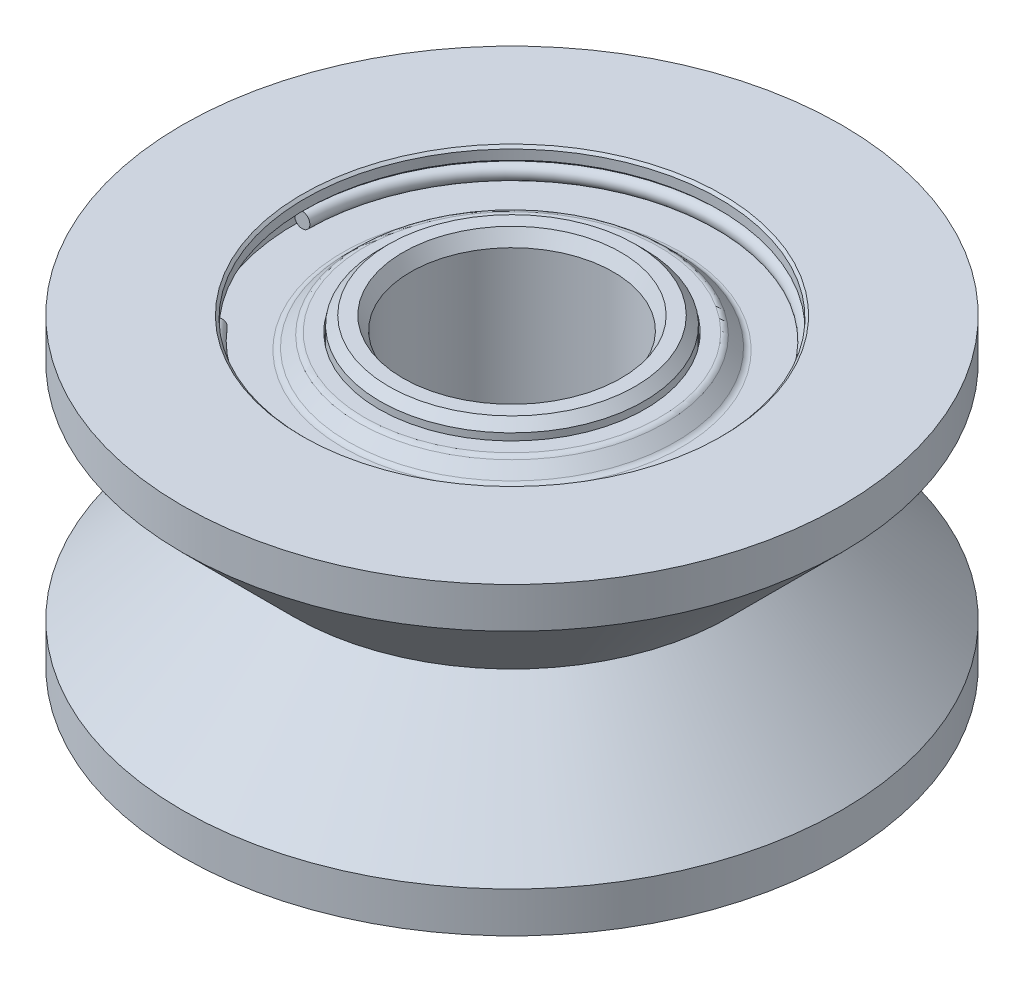
ISO-10303-21;
HEADER;
FILE_DESCRIPTION(('STEP AP214'),'2;1');
FILE_NAME('part.step','',(''),(''),'','','');
FILE_SCHEMA(('AUTOMOTIVE_DESIGN { 1 0 10303 214 1 1 1 1 }'));
ENDSEC;
DATA;
#1=APPLICATION_CONTEXT('core data for automotive mechanical design processes');
#2=APPLICATION_PROTOCOL_DEFINITION('international standard','automotive_design',2000,#1);
#3=PRODUCT_CONTEXT('',#1,'mechanical');
#4=PRODUCT('Part','Part','',(#3));
#5=PRODUCT_RELATED_PRODUCT_CATEGORY('part','',(#4));
#6=PRODUCT_DEFINITION_FORMATION('','',#4);
#7=PRODUCT_DEFINITION_CONTEXT('part definition',#1,'design');
#8=PRODUCT_DEFINITION('design','',#6,#7);
#9=PRODUCT_DEFINITION_SHAPE('','',#8);
#10=(LENGTH_UNIT() NAMED_UNIT(*) SI_UNIT(.MILLI.,.METRE.));
#11=(NAMED_UNIT(*) PLANE_ANGLE_UNIT() SI_UNIT($,.RADIAN.));
#12=(NAMED_UNIT(*) SI_UNIT($,.STERADIAN.) SOLID_ANGLE_UNIT());
#13=UNCERTAINTY_MEASURE_WITH_UNIT(LENGTH_MEASURE(1.E-05),#10,'distance_accuracy_value','');
#14=(GEOMETRIC_REPRESENTATION_CONTEXT(3) GLOBAL_UNCERTAINTY_ASSIGNED_CONTEXT((#13)) GLOBAL_UNIT_ASSIGNED_CONTEXT((#10,
#11,#12)) REPRESENTATION_CONTEXT('',''));
#15=CARTESIAN_POINT('',(0.,0.,0.));
#16=DIRECTION('',(0.,0.,1.));
#17=DIRECTION('',(1.,0.,0.));
#18=AXIS2_PLACEMENT_3D('',#15,#16,#17);
#19=CARTESIAN_POINT('',(0.,0.544,0.));
#20=DIRECTION('',(0.,-1.,0.));
#21=DIRECTION('',(0.,0.,-1.));
#22=AXIS2_PLACEMENT_3D('',#19,#20,#21);
#23=PLANE('',#22);
#24=CARTESIAN_POINT('',(0.,0.544,0.));
#25=DIRECTION('',(0.,-1.,0.));
#26=DIRECTION('',(0.,0.,1.));
#27=AXIS2_PLACEMENT_3D('',#24,#25,#26);
#28=CIRCLE('',#27,2.6);
#29=CARTESIAN_POINT('',(0.,0.544,2.6));
#30=VERTEX_POINT('',#29);
#31=EDGE_CURVE('P0_E32',#30,#30,#28,.T.);
#32=ORIENTED_EDGE('',*,*,#31,.F.);
#33=EDGE_LOOP('',(#32));
#34=FACE_BOUND('',#33,.T.);
#35=CARTESIAN_POINT('',(0.,0.544,0.));
#36=DIRECTION('',(0.,1.,0.));
#37=DIRECTION('',(0.,0.,1.));
#38=AXIS2_PLACEMENT_3D('',#35,#36,#37);
#39=CIRCLE('',#38,2.625);
#40=CARTESIAN_POINT('',(0.,0.544,2.625));
#41=VERTEX_POINT('',#40);
#42=EDGE_CURVE('P0_E97',#41,#41,#39,.T.);
#43=ORIENTED_EDGE('',*,*,#42,.F.);
#44=EDGE_LOOP('',(#43));
#45=FACE_BOUND('',#44,.T.);
#46=ADVANCED_FACE('P0_F15',(#34,#45),#23,.T.);
#47=CARTESIAN_POINT('',(0.,5.456,0.));
#48=DIRECTION('',(0.,1.,0.));
#49=DIRECTION('',(1.,0.,0.));
#50=AXIS2_PLACEMENT_3D('',#47,#48,#49);
#51=PLANE('',#50);
#52=CARTESIAN_POINT('',(0.,5.456,0.));
#53=DIRECTION('',(0.,-1.,0.));
#54=DIRECTION('',(0.,0.,1.));
#55=AXIS2_PLACEMENT_3D('',#52,#53,#54);
#56=CIRCLE('',#55,2.6);
#57=CARTESIAN_POINT('',(0.,5.456,2.6));
#58=VERTEX_POINT('',#57);
#59=EDGE_CURVE('P0_E23',#58,#58,#56,.T.);
#60=ORIENTED_EDGE('',*,*,#59,.T.);
#61=EDGE_LOOP('',(#60));
#62=FACE_BOUND('',#61,.T.);
#63=CARTESIAN_POINT('',(0.,5.456,0.));
#64=DIRECTION('',(0.,1.,0.));
#65=DIRECTION('',(0.,0.,1.));
#66=AXIS2_PLACEMENT_3D('',#63,#64,#65);
#67=CIRCLE('',#66,2.625);
#68=CARTESIAN_POINT('',(0.,5.456,2.625));
#69=VERTEX_POINT('',#68);
#70=EDGE_CURVE('P0_E94',#69,#69,#67,.T.);
#71=ORIENTED_EDGE('',*,*,#70,.T.);
#72=EDGE_LOOP('',(#71));
#73=FACE_BOUND('',#72,.T.);
#74=ADVANCED_FACE('P0_F17',(#62,#73),#51,.T.);
#75=CARTESIAN_POINT('',(0.,0.59,0.));
#76=DIRECTION('',(0.,-1.,0.));
#77=DIRECTION('',(0.,0.,-1.));
#78=AXIS2_PLACEMENT_3D('',#75,#76,#77);
#79=PLANE('',#78);
#80=CARTESIAN_POINT('',(0.,0.59,0.));
#81=DIRECTION('',(0.,1.,0.));
#82=DIRECTION('',(0.,0.,-1.));
#83=AXIS2_PLACEMENT_3D('',#80,#81,#82);
#84=CIRCLE('',#83,3.32453017998293);
#85=CARTESIAN_POINT('',(0.,0.59,-3.32453017998293));
#86=VERTEX_POINT('',#85);
#87=EDGE_CURVE('P0_E68',#86,#86,#84,.T.);
#88=ORIENTED_EDGE('',*,*,#87,.T.);
#89=EDGE_LOOP('',(#88));
#90=FACE_BOUND('',#89,.T.);
#91=CARTESIAN_POINT('',(0.,0.59,0.));
#92=DIRECTION('',(0.,1.,0.));
#93=DIRECTION('',(0.,0.,1.));
#94=AXIS2_PLACEMENT_3D('',#91,#92,#93);
#95=CIRCLE('',#94,4.285);
#96=CARTESIAN_POINT('',(0.,0.59,4.285));
#97=VERTEX_POINT('',#96);
#98=EDGE_CURVE('P0_E63',#97,#97,#95,.T.);
#99=ORIENTED_EDGE('',*,*,#98,.F.);
#100=EDGE_LOOP('',(#99));
#101=FACE_BOUND('',#100,.T.);
#102=ADVANCED_FACE('P0_F209',(#90,#101),#79,.T.);
#103=CARTESIAN_POINT('',(0.,0.29,0.));
#104=DIRECTION('',(0.,-1.,0.));
#105=DIRECTION('',(0.,0.,-1.));
#106=AXIS2_PLACEMENT_3D('',#103,#104,#105);
#107=PLANE('',#106);
#108=CARTESIAN_POINT('',(0.,0.29,0.));
#109=DIRECTION('',(0.,-1.,0.));
#110=DIRECTION('',(0.,0.,-1.));
#111=AXIS2_PLACEMENT_3D('',#108,#109,#110);
#112=CIRCLE('',#111,4.135);
#113=CARTESIAN_POINT('',(0.,0.29,-4.135));
#114=VERTEX_POINT('',#113);
#115=EDGE_CURVE('P0_E83',#114,#114,#112,.T.);
#116=ORIENTED_EDGE('',*,*,#115,.T.);
#117=EDGE_LOOP('',(#116));
#118=FACE_BOUND('',#117,.T.);
#119=CARTESIAN_POINT('',(0.,0.29,0.));
#120=DIRECTION('',(0.,1.,0.));
#121=DIRECTION('',(0.,0.,1.));
#122=AXIS2_PLACEMENT_3D('',#119,#120,#121);
#123=CIRCLE('',#122,4.285);
#124=CARTESIAN_POINT('',(0.,0.29,4.285));
#125=VERTEX_POINT('',#124);
#126=EDGE_CURVE('P0_E56',#125,#125,#123,.T.);
#127=ORIENTED_EDGE('',*,*,#126,.T.);
#128=EDGE_LOOP('',(#127));
#129=FACE_BOUND('',#128,.T.);
#130=ADVANCED_FACE('P0_F199',(#118,#129),#107,.F.);
#131=CARTESIAN_POINT('',(0.,5.41,0.));
#132=DIRECTION('',(0.,1.,0.));
#133=DIRECTION('',(1.,0.,0.));
#134=AXIS2_PLACEMENT_3D('',#131,#132,#133);
#135=PLANE('',#134);
#136=CARTESIAN_POINT('',(0.,5.41,0.));
#137=DIRECTION('',(0.,-1.,0.));
#138=DIRECTION('',(0.,0.,1.));
#139=AXIS2_PLACEMENT_3D('',#136,#137,#138);
#140=CIRCLE('',#139,3.33453017998293);
#141=CARTESIAN_POINT('',(0.,5.41,3.33453017998293));
#142=VERTEX_POINT('',#141);
#143=EDGE_CURVE('P0_E139',#142,#142,#140,.T.);
#144=ORIENTED_EDGE('',*,*,#143,.T.);
#145=EDGE_LOOP('',(#144));
#146=FACE_BOUND('',#145,.T.);
#147=CARTESIAN_POINT('',(0.,5.41,0.));
#148=DIRECTION('',(0.,1.,0.));
#149=DIRECTION('',(0.,0.,1.));
#150=AXIS2_PLACEMENT_3D('',#147,#148,#149);
#151=CIRCLE('',#150,4.285);
#152=CARTESIAN_POINT('',(0.,5.41,4.285));
#153=VERTEX_POINT('',#152);
#154=EDGE_CURVE('P0_E64',#153,#153,#151,.T.);
#155=ORIENTED_EDGE('',*,*,#154,.T.);
#156=EDGE_LOOP('',(#155));
#157=FACE_BOUND('',#156,.T.);
#158=ADVANCED_FACE('P0_F187',(#146,#157),#135,.T.);
#159=CARTESIAN_POINT('',(0.,5.71,0.));
#160=DIRECTION('',(0.,1.,0.));
#161=DIRECTION('',(1.,0.,0.));
#162=AXIS2_PLACEMENT_3D('',#159,#160,#161);
#163=PLANE('',#162);
#164=CARTESIAN_POINT('',(0.,5.71,0.));
#165=DIRECTION('',(0.,1.,0.));
#166=DIRECTION('',(0.,0.,1.));
#167=AXIS2_PLACEMENT_3D('',#164,#165,#166);
#168=CIRCLE('',#167,4.135);
#169=CARTESIAN_POINT('',(0.,5.71,4.135));
#170=VERTEX_POINT('',#169);
#171=EDGE_CURVE('P0_E71',#170,#170,#168,.T.);
#172=ORIENTED_EDGE('',*,*,#171,.T.);
#173=EDGE_LOOP('',(#172));
#174=FACE_BOUND('',#173,.T.);
#175=CARTESIAN_POINT('',(0.,5.71,0.));
#176=DIRECTION('',(0.,1.,0.));
#177=DIRECTION('',(0.,0.,1.));
#178=AXIS2_PLACEMENT_3D('',#175,#176,#177);
#179=CIRCLE('',#178,4.285);
#180=CARTESIAN_POINT('',(0.,5.71,4.285));
#181=VERTEX_POINT('',#180);
#182=EDGE_CURVE('P0_E41',#181,#181,#179,.T.);
#183=ORIENTED_EDGE('',*,*,#182,.F.);
#184=EDGE_LOOP('',(#183));
#185=FACE_BOUND('',#184,.T.);
#186=ADVANCED_FACE('P0_F184',(#174,#185),#163,.F.);
#187=CARTESIAN_POINT('',(0.,0.,0.));
#188=DIRECTION('',(0.,1.,0.));
#189=DIRECTION('',(1.,0.,0.));
#190=AXIS2_PLACEMENT_3D('',#187,#188,#189);
#191=PLANE('',#190);
#192=CARTESIAN_POINT('',(0.,0.,0.));
#193=DIRECTION('',(0.,1.,0.));
#194=DIRECTION('',(0.,0.,1.));
#195=AXIS2_PLACEMENT_3D('',#192,#193,#194);
#196=CIRCLE('',#195,4.135);
#197=CARTESIAN_POINT('',(0.,0.,4.135));
#198=VERTEX_POINT('',#197);
#199=EDGE_CURVE('P0_E102',#198,#198,#196,.T.);
#200=ORIENTED_EDGE('',*,*,#199,.T.);
#201=EDGE_LOOP('',(#200));
#202=FACE_BOUND('',#201,.T.);
#203=CARTESIAN_POINT('',(0.,0.,0.));
#204=DIRECTION('',(0.,-1.,0.));
#205=DIRECTION('',(0.,0.,1.));
#206=AXIS2_PLACEMENT_3D('',#203,#204,#205);
#207=CIRCLE('',#206,6.5);
#208=CARTESIAN_POINT('',(0.,0.,6.5));
#209=VERTEX_POINT('',#208);
#210=EDGE_CURVE('P0_E59',#209,#209,#207,.T.);
#211=ORIENTED_EDGE('',*,*,#210,.T.);
#212=EDGE_LOOP('',(#211));
#213=FACE_BOUND('',#212,.T.);
#214=ADVANCED_FACE('P0_F190',(#202,#213),#191,.F.);
#215=CARTESIAN_POINT('',(0.,6.,0.));
#216=DIRECTION('',(0.,1.,0.));
#217=DIRECTION('',(1.,0.,0.));
#218=AXIS2_PLACEMENT_3D('',#215,#216,#217);
#219=PLANE('',#218);
#220=CARTESIAN_POINT('',(0.,6.,0.));
#221=DIRECTION('',(0.,-1.,0.));
#222=DIRECTION('',(0.,0.,1.));
#223=AXIS2_PLACEMENT_3D('',#220,#221,#222);
#224=CIRCLE('',#223,2.15);
#225=CARTESIAN_POINT('',(0.,6.,2.15));
#226=VERTEX_POINT('',#225);
#227=EDGE_CURVE('P0_E92',#226,#226,#224,.T.);
#228=ORIENTED_EDGE('',*,*,#227,.T.);
#229=EDGE_LOOP('',(#228));
#230=FACE_BOUND('',#229,.T.);
#231=CARTESIAN_POINT('',(0.,6.,0.));
#232=DIRECTION('',(0.,1.,0.));
#233=DIRECTION('',(0.,0.,1.));
#234=AXIS2_PLACEMENT_3D('',#231,#232,#233);
#235=CIRCLE('',#234,2.43);
#236=CARTESIAN_POINT('',(0.,6.,2.43));
#237=VERTEX_POINT('',#236);
#238=EDGE_CURVE('P0_E107',#237,#237,#235,.T.);
#239=ORIENTED_EDGE('',*,*,#238,.T.);
#240=EDGE_LOOP('',(#239));
#241=FACE_BOUND('',#240,.T.);
#242=ADVANCED_FACE('P0_F198',(#230,#241),#219,.T.);
#243=CARTESIAN_POINT('',(0.,0.,0.));
#244=DIRECTION('',(0.,1.,0.));
#245=DIRECTION('',(1.,0.,0.));
#246=AXIS2_PLACEMENT_3D('',#243,#244,#245);
#247=PLANE('',#246);
#248=CARTESIAN_POINT('',(0.,0.,0.));
#249=DIRECTION('',(0.,1.,0.));
#250=DIRECTION('',(0.,0.,1.));
#251=AXIS2_PLACEMENT_3D('',#248,#249,#250);
#252=CIRCLE('',#251,2.15);
#253=CARTESIAN_POINT('',(0.,0.,2.15));
#254=VERTEX_POINT('',#253);
#255=EDGE_CURVE('P0_E135',#254,#254,#252,.T.);
#256=ORIENTED_EDGE('',*,*,#255,.T.);
#257=EDGE_LOOP('',(#256));
#258=FACE_BOUND('',#257,.T.);
#259=CARTESIAN_POINT('',(0.,0.,0.));
#260=DIRECTION('',(0.,-1.,0.));
#261=DIRECTION('',(0.,0.,1.));
#262=AXIS2_PLACEMENT_3D('',#259,#260,#261);
#263=CIRCLE('',#262,2.43);
#264=CARTESIAN_POINT('',(0.,0.,2.43));
#265=VERTEX_POINT('',#264);
#266=EDGE_CURVE('P0_E120',#265,#265,#263,.T.);
#267=ORIENTED_EDGE('',*,*,#266,.T.);
#268=EDGE_LOOP('',(#267));
#269=FACE_BOUND('',#268,.T.);
#270=ADVANCED_FACE('P0_F241',(#258,#269),#247,.F.);
#271=CARTESIAN_POINT('',(0.,5.71,0.));
#272=DIRECTION('',(0.,1.,0.));
#273=DIRECTION('',(1.,0.,0.));
#274=AXIS2_PLACEMENT_3D('',#271,#272,#273);
#275=PLANE('',#274);
#276=CARTESIAN_POINT('',(0.,5.71,0.));
#277=DIRECTION('',(0.,1.,0.));
#278=DIRECTION('',(0.,0.,1.));
#279=AXIS2_PLACEMENT_3D('',#276,#277,#278);
#280=CIRCLE('',#279,2.625);
#281=CARTESIAN_POINT('',(0.,5.71,2.625));
#282=VERTEX_POINT('',#281);
#283=EDGE_CURVE('P0_E89',#282,#282,#280,.T.);
#284=ORIENTED_EDGE('',*,*,#283,.F.);
#285=EDGE_LOOP('',(#284));
#286=FACE_BOUND('',#285,.T.);
#287=CARTESIAN_POINT('',(0.,5.71,0.));
#288=DIRECTION('',(0.,1.,0.));
#289=DIRECTION('',(0.,0.,1.));
#290=AXIS2_PLACEMENT_3D('',#287,#288,#289);
#291=CIRCLE('',#290,2.910266111271);
#292=CARTESIAN_POINT('',(0.,5.71,2.910266111271));
#293=VERTEX_POINT('',#292);
#294=EDGE_CURVE('P0_E149',#293,#293,#291,.T.);
#295=ORIENTED_EDGE('',*,*,#294,.T.);
#296=EDGE_LOOP('',(#295));
#297=FACE_BOUND('',#296,.T.);
#298=ADVANCED_FACE('P0_F236',(#286,#297),#275,.T.);
#299=CARTESIAN_POINT('',(0.,0.3,0.));
#300=DIRECTION('',(0.,-1.,0.));
#301=DIRECTION('',(0.,0.,-1.));
#302=AXIS2_PLACEMENT_3D('',#299,#300,#301);
#303=PLANE('',#302);
#304=CARTESIAN_POINT('',(0.,0.3,0.));
#305=DIRECTION('',(0.,1.,0.));
#306=DIRECTION('',(0.,0.,-1.));
#307=AXIS2_PLACEMENT_3D('',#304,#305,#306);
#308=CIRCLE('',#307,2.625);
#309=CARTESIAN_POINT('',(0.,0.3,-2.625));
#310=VERTEX_POINT('',#309);
#311=EDGE_CURVE('P0_E116',#310,#310,#308,.T.);
#312=ORIENTED_EDGE('',*,*,#311,.T.);
#313=EDGE_LOOP('',(#312));
#314=FACE_BOUND('',#313,.T.);
#315=CARTESIAN_POINT('',(0.,0.3,0.));
#316=DIRECTION('',(0.,-1.,0.));
#317=DIRECTION('',(0.,0.,-1.));
#318=AXIS2_PLACEMENT_3D('',#315,#316,#317);
#319=CIRCLE('',#318,2.910266111271);
#320=CARTESIAN_POINT('',(0.,0.3,-2.910266111271));
#321=VERTEX_POINT('',#320);
#322=EDGE_CURVE('P0_E170',#321,#321,#319,.T.);
#323=ORIENTED_EDGE('',*,*,#322,.T.);
#324=EDGE_LOOP('',(#323));
#325=FACE_BOUND('',#324,.T.);
#326=ADVANCED_FACE('P0_F233',(#314,#325),#303,.T.);
#327=CARTESIAN_POINT('',(0.,6.,0.));
#328=DIRECTION('',(0.,1.,0.));
#329=DIRECTION('',(1.,0.,0.));
#330=AXIS2_PLACEMENT_3D('',#327,#328,#329);
#331=PLANE('',#330);
#332=CARTESIAN_POINT('',(0.,6.,0.));
#333=DIRECTION('',(0.,-1.,0.));
#334=DIRECTION('',(0.,0.,1.));
#335=AXIS2_PLACEMENT_3D('',#332,#333,#334);
#336=CIRCLE('',#335,4.135);
#337=CARTESIAN_POINT('',(0.,6.,4.135));
#338=VERTEX_POINT('',#337);
#339=EDGE_CURVE('P0_E49',#338,#338,#336,.T.);
#340=ORIENTED_EDGE('',*,*,#339,.T.);
#341=EDGE_LOOP('',(#340));
#342=FACE_BOUND('',#341,.T.);
#343=CARTESIAN_POINT('',(0.,6.,0.));
#344=DIRECTION('',(0.,1.,0.));
#345=DIRECTION('',(0.,0.,1.));
#346=AXIS2_PLACEMENT_3D('',#343,#344,#345);
#347=CIRCLE('',#346,6.5);
#348=CARTESIAN_POINT('',(0.,6.,6.5));
#349=VERTEX_POINT('',#348);
#350=EDGE_CURVE('P0_E10',#349,#349,#347,.T.);
#351=ORIENTED_EDGE('',*,*,#350,.T.);
#352=EDGE_LOOP('',(#351));
#353=FACE_BOUND('',#352,.T.);
#354=ADVANCED_FACE('P0_F230',(#342,#353),#331,.T.);
#355=CARTESIAN_POINT('',(0.,4.05,0.));
#356=DIRECTION('',(0.,-1.,0.));
#357=DIRECTION('',(0.,0.,-1.));
#358=AXIS2_PLACEMENT_3D('',#355,#356,#357);
#359=CYLINDRICAL_SURFACE('',#358,6.5);
#360=CARTESIAN_POINT('',(0.,5.2,0.));
#361=DIRECTION('',(0.,1.,0.));
#362=DIRECTION('',(0.,0.,1.));
#363=AXIS2_PLACEMENT_3D('',#360,#361,#362);
#364=CIRCLE('',#363,6.5);
#365=CARTESIAN_POINT('',(0.,5.2,6.5));
#366=VERTEX_POINT('',#365);
#367=EDGE_CURVE('P0_E47',#366,#366,#364,.T.);
#368=ORIENTED_EDGE('',*,*,#367,.T.);
#369=EDGE_LOOP('',(#368));
#370=FACE_BOUND('',#369,.T.);
#371=ORIENTED_EDGE('',*,*,#350,.F.);
#372=EDGE_LOOP('',(#371));
#373=FACE_BOUND('',#372,.T.);
#374=ADVANCED_FACE('P0_F229',(#370,#373),#359,.T.);
#375=CARTESIAN_POINT('',(0.,0.,0.));
#376=DIRECTION('',(0.,1.,0.));
#377=DIRECTION('',(0.,0.,1.));
#378=AXIS2_PLACEMENT_3D('',#375,#376,#377);
#379=CYLINDRICAL_SURFACE('',#378,2.);
#380=CARTESIAN_POINT('',(0.,5.74019237886467,0.));
#381=DIRECTION('',(0.,1.,0.));
#382=DIRECTION('',(0.,0.,1.));
#383=AXIS2_PLACEMENT_3D('',#380,#381,#382);
#384=CIRCLE('',#383,2.);
#385=CARTESIAN_POINT('',(0.,5.74019237886467,2.));
#386=VERTEX_POINT('',#385);
#387=EDGE_CURVE('P0_E99',#386,#386,#384,.T.);
#388=ORIENTED_EDGE('',*,*,#387,.T.);
#389=EDGE_LOOP('',(#388));
#390=FACE_BOUND('',#389,.T.);
#391=CARTESIAN_POINT('',(0.,0.25980762113533,0.));
#392=DIRECTION('',(0.,-1.,0.));
#393=DIRECTION('',(0.,0.,1.));
#394=AXIS2_PLACEMENT_3D('',#391,#392,#393);
#395=CIRCLE('',#394,2.);
#396=CARTESIAN_POINT('',(0.,0.25980762113533,2.));
#397=VERTEX_POINT('',#396);
#398=EDGE_CURVE('P0_E128',#397,#397,#395,.T.);
#399=ORIENTED_EDGE('',*,*,#398,.T.);
#400=EDGE_LOOP('',(#399));
#401=FACE_BOUND('',#400,.T.);
#402=ADVANCED_FACE('P0_F221',(#390,#401),#379,.F.);
#403=CARTESIAN_POINT('',(0.,5.71,0.));
#404=DIRECTION('',(0.,1.,0.));
#405=DIRECTION('',(0.,0.,1.));
#406=AXIS2_PLACEMENT_3D('',#403,#404,#405);
#407=CYLINDRICAL_SURFACE('',#406,4.085);
#408=CARTESIAN_POINT('',(0.,5.95,0.));
#409=DIRECTION('',(0.,1.,0.));
#410=DIRECTION('',(0.,0.,1.));
#411=AXIS2_PLACEMENT_3D('',#408,#409,#410);
#412=CIRCLE('',#411,4.085);
#413=CARTESIAN_POINT('',(0.,5.95,4.085));
#414=VERTEX_POINT('',#413);
#415=EDGE_CURVE('P0_E54',#414,#414,#412,.T.);
#416=ORIENTED_EDGE('',*,*,#415,.T.);
#417=EDGE_LOOP('',(#416));
#418=FACE_BOUND('',#417,.T.);
#419=CARTESIAN_POINT('',(0.,5.76,0.));
#420=DIRECTION('',(0.,-1.,0.));
#421=DIRECTION('',(0.,0.,1.));
#422=AXIS2_PLACEMENT_3D('',#419,#420,#421);
#423=CIRCLE('',#422,4.085);
#424=CARTESIAN_POINT('',(0.,5.76,4.085));
#425=VERTEX_POINT('',#424);
#426=EDGE_CURVE('P0_E53',#425,#425,#423,.T.);
#427=ORIENTED_EDGE('',*,*,#426,.T.);
#428=EDGE_LOOP('',(#427));
#429=FACE_BOUND('',#428,.T.);
#430=ADVANCED_FACE('P0_F219',(#418,#429),#407,.F.);
#431=CARTESIAN_POINT('',(0.,5.71,0.));
#432=DIRECTION('',(0.,1.,0.));
#433=DIRECTION('',(0.,0.,1.));
#434=AXIS2_PLACEMENT_3D('',#431,#432,#433);
#435=CYLINDRICAL_SURFACE('',#434,2.6);
#436=CARTESIAN_POINT('',(0.,5.83,0.));
#437=DIRECTION('',(0.,-1.,0.));
#438=DIRECTION('',(0.,0.,1.));
#439=AXIS2_PLACEMENT_3D('',#436,#437,#438);
#440=CIRCLE('',#439,2.6);
#441=CARTESIAN_POINT('',(0.,5.83,2.6));
#442=VERTEX_POINT('',#441);
#443=EDGE_CURVE('P0_E115',#442,#442,#440,.T.);
#444=ORIENTED_EDGE('',*,*,#443,.T.);
#445=EDGE_LOOP('',(#444));
#446=FACE_BOUND('',#445,.T.);
#447=ORIENTED_EDGE('',*,*,#59,.F.);
#448=EDGE_LOOP('',(#447));
#449=FACE_BOUND('',#448,.T.);
#450=ADVANCED_FACE('P0_F220',(#446,#449),#435,.T.);
#451=CARTESIAN_POINT('',(0.,0.3,0.));
#452=DIRECTION('',(0.,-1.,0.));
#453=DIRECTION('',(0.,0.,-1.));
#454=AXIS2_PLACEMENT_3D('',#451,#452,#453);
#455=CYLINDRICAL_SURFACE('',#454,4.085);
#456=CARTESIAN_POINT('',(0.,0.05,0.));
#457=DIRECTION('',(0.,-1.,0.));
#458=DIRECTION('',(0.,0.,1.));
#459=AXIS2_PLACEMENT_3D('',#456,#457,#458);
#460=CIRCLE('',#459,4.085);
#461=CARTESIAN_POINT('',(0.,0.05,4.085));
#462=VERTEX_POINT('',#461);
#463=EDGE_CURVE('P0_E90',#462,#462,#460,.T.);
#464=ORIENTED_EDGE('',*,*,#463,.T.);
#465=EDGE_LOOP('',(#464));
#466=FACE_BOUND('',#465,.T.);
#467=CARTESIAN_POINT('',(0.,0.24,0.));
#468=DIRECTION('',(0.,1.,0.));
#469=DIRECTION('',(0.,0.,-1.));
#470=AXIS2_PLACEMENT_3D('',#467,#468,#469);
#471=CIRCLE('',#470,4.085);
#472=CARTESIAN_POINT('',(0.,0.24,-4.085));
#473=VERTEX_POINT('',#472);
#474=EDGE_CURVE('P0_E82',#473,#473,#471,.T.);
#475=ORIENTED_EDGE('',*,*,#474,.T.);
#476=EDGE_LOOP('',(#475));
#477=FACE_BOUND('',#476,.T.);
#478=ADVANCED_FACE('P0_F214',(#466,#477),#455,.F.);
#479=CARTESIAN_POINT('',(0.,0.3,0.));
#480=DIRECTION('',(0.,-1.,0.));
#481=DIRECTION('',(0.,0.,-1.));
#482=AXIS2_PLACEMENT_3D('',#479,#480,#481);
#483=CYLINDRICAL_SURFACE('',#482,2.6);
#484=CARTESIAN_POINT('',(0.,0.17,0.));
#485=DIRECTION('',(0.,1.,0.));
#486=DIRECTION('',(0.,0.,1.));
#487=AXIS2_PLACEMENT_3D('',#484,#485,#486);
#488=CIRCLE('',#487,2.6);
#489=CARTESIAN_POINT('',(0.,0.17,2.6));
#490=VERTEX_POINT('',#489);
#491=EDGE_CURVE('P0_E122',#490,#490,#488,.T.);
#492=ORIENTED_EDGE('',*,*,#491,.T.);
#493=EDGE_LOOP('',(#492));
#494=FACE_BOUND('',#493,.T.);
#495=ORIENTED_EDGE('',*,*,#31,.T.);
#496=EDGE_LOOP('',(#495));
#497=FACE_BOUND('',#496,.T.);
#498=ADVANCED_FACE('P0_F309',(#494,#497),#483,.T.);
#499=CARTESIAN_POINT('',(0.,5.41,0.));
#500=DIRECTION('',(0.,1.,0.));
#501=DIRECTION('',(0.,0.,1.));
#502=AXIS2_PLACEMENT_3D('',#499,#500,#501);
#503=CYLINDRICAL_SURFACE('',#502,4.285);
#504=ORIENTED_EDGE('',*,*,#182,.T.);
#505=EDGE_LOOP('',(#504));
#506=FACE_BOUND('',#505,.T.);
#507=ORIENTED_EDGE('',*,*,#154,.F.);
#508=EDGE_LOOP('',(#507));
#509=FACE_BOUND('',#508,.T.);
#510=ADVANCED_FACE('P0_F181',(#506,#509),#503,.F.);
#511=CARTESIAN_POINT('',(0.,0.59,0.));
#512=DIRECTION('',(0.,-1.,0.));
#513=DIRECTION('',(0.,0.,-1.));
#514=AXIS2_PLACEMENT_3D('',#511,#512,#513);
#515=CYLINDRICAL_SURFACE('',#514,4.285);
#516=ORIENTED_EDGE('',*,*,#126,.F.);
#517=EDGE_LOOP('',(#516));
#518=FACE_BOUND('',#517,.T.);
#519=ORIENTED_EDGE('',*,*,#98,.T.);
#520=EDGE_LOOP('',(#519));
#521=FACE_BOUND('',#520,.T.);
#522=ADVANCED_FACE('P0_F272',(#518,#521),#515,.F.);
#523=CARTESIAN_POINT('',(0.,0.6,0.));
#524=DIRECTION('',(0.,1.,0.));
#525=DIRECTION('',(0.,0.,1.));
#526=AXIS2_PLACEMENT_3D('',#523,#524,#525);
#527=CONICAL_SURFACE('',#526,3.27239814562697,0.785398163397443);
#528=CARTESIAN_POINT('',(0.,0.546066017177982,0.));
#529=DIRECTION('',(0.,-1.,0.));
#530=DIRECTION('',(0.,0.,1.));
#531=AXIS2_PLACEMENT_3D('',#528,#529,#530);
#532=CIRCLE('',#531,3.21846416280495);
#533=CARTESIAN_POINT('',(0.,0.546066017177982,3.21846416280495));
#534=VERTEX_POINT('',#533);
#535=EDGE_CURVE('P0_E157',#534,#534,#532,.T.);
#536=ORIENTED_EDGE('',*,*,#535,.T.);
#537=EDGE_LOOP('',(#536));
#538=FACE_BOUND('',#537,.T.);
#539=CARTESIAN_POINT('',(0.,0.343933982822018,0.));
#540=DIRECTION('',(0.,1.,0.));
#541=DIRECTION('',(0.,0.,-1.));
#542=AXIS2_PLACEMENT_3D('',#539,#540,#541);
#543=CIRCLE('',#542,3.01633212844899);
#544=CARTESIAN_POINT('',(0.,0.343933982822018,-3.01633212844899));
#545=VERTEX_POINT('',#544);
#546=EDGE_CURVE('P0_E162',#545,#545,#543,.T.);
#547=ORIENTED_EDGE('',*,*,#546,.T.);
#548=EDGE_LOOP('',(#547));
#549=FACE_BOUND('',#548,.T.);
#550=ADVANCED_FACE('P0_F277',(#538,#549),#527,.T.);
#551=CARTESIAN_POINT('',(0.,5.71,0.));
#552=DIRECTION('',(0.,-1.,0.));
#553=DIRECTION('',(0.,0.,-1.));
#554=AXIS2_PLACEMENT_3D('',#551,#552,#553);
#555=CONICAL_SURFACE('',#554,2.97239814562697,0.785398163397448);
#556=CARTESIAN_POINT('',(0.,5.45393398282202,0.));
#557=DIRECTION('',(0.,1.,0.));
#558=DIRECTION('',(0.,0.,-1.));
#559=AXIS2_PLACEMENT_3D('',#556,#557,#558);
#560=CIRCLE('',#559,3.22846416280495);
#561=CARTESIAN_POINT('',(0.,5.45393398282202,-3.22846416280495));
#562=VERTEX_POINT('',#561);
#563=EDGE_CURVE('P0_E91',#562,#562,#560,.T.);
#564=ORIENTED_EDGE('',*,*,#563,.T.);
#565=EDGE_LOOP('',(#564));
#566=FACE_BOUND('',#565,.T.);
#567=CARTESIAN_POINT('',(0.,5.66606601717798,0.));
#568=DIRECTION('',(0.,-1.,0.));
#569=DIRECTION('',(0.,0.,1.));
#570=AXIS2_PLACEMENT_3D('',#567,#568,#569);
#571=CIRCLE('',#570,3.01633212844899);
#572=CARTESIAN_POINT('',(0.,5.66606601717798,3.01633212844899));
#573=VERTEX_POINT('',#572);
#574=EDGE_CURVE('P0_E142',#573,#573,#571,.T.);
#575=ORIENTED_EDGE('',*,*,#574,.T.);
#576=EDGE_LOOP('',(#575));
#577=FACE_BOUND('',#576,.T.);
#578=ADVANCED_FACE('P0_F299',(#566,#577),#555,.T.);
#579=CARTESIAN_POINT('',(0.,0.44,0.));
#580=DIRECTION('',(0.,-1.,0.));
#581=DIRECTION('',(0.,0.,-1.));
#582=AXIS2_PLACEMENT_3D('',#579,#580,#581);
#583=TOROIDAL_SURFACE('',#582,3.32453017998293,0.15);
#584=ORIENTED_EDGE('',*,*,#87,.F.);
#585=EDGE_LOOP('',(#584));
#586=FACE_BOUND('',#585,.T.);
#587=ORIENTED_EDGE('',*,*,#535,.F.);
#588=EDGE_LOOP('',(#587));
#589=FACE_BOUND('',#588,.T.);
#590=ADVANCED_FACE('P0_F281',(#586,#589),#583,.F.);
#591=CARTESIAN_POINT('',(0.,0.45,0.));
#592=DIRECTION('',(0.,-1.,0.));
#593=DIRECTION('',(0.,0.,-1.));
#594=AXIS2_PLACEMENT_3D('',#591,#592,#593);
#595=TOROIDAL_SURFACE('',#594,2.910266111271,0.15);
#596=ORIENTED_EDGE('',*,*,#322,.F.);
#597=EDGE_LOOP('',(#596));
#598=FACE_BOUND('',#597,.T.);
#599=ORIENTED_EDGE('',*,*,#546,.F.);
#600=EDGE_LOOP('',(#599));
#601=FACE_BOUND('',#600,.T.);
#602=ADVANCED_FACE('P0_F279',(#598,#601),#595,.T.);
#603=CARTESIAN_POINT('',(0.,5.56,0.));
#604=DIRECTION('',(0.,1.,0.));
#605=DIRECTION('',(0.,0.,1.));
#606=AXIS2_PLACEMENT_3D('',#603,#604,#605);
#607=TOROIDAL_SURFACE('',#606,2.910266111271,0.15);
#608=ORIENTED_EDGE('',*,*,#294,.F.);
#609=EDGE_LOOP('',(#608));
#610=FACE_BOUND('',#609,.T.);
#611=ORIENTED_EDGE('',*,*,#574,.F.);
#612=EDGE_LOOP('',(#611));
#613=FACE_BOUND('',#612,.T.);
#614=ADVANCED_FACE('P0_F278',(#610,#613),#607,.T.);
#615=CARTESIAN_POINT('',(0.,5.56,0.));
#616=DIRECTION('',(0.,1.,0.));
#617=DIRECTION('',(0.,0.,1.));
#618=AXIS2_PLACEMENT_3D('',#615,#616,#617);
#619=TOROIDAL_SURFACE('',#618,3.33453017998293,0.15);
#620=ORIENTED_EDGE('',*,*,#143,.F.);
#621=EDGE_LOOP('',(#620));
#622=FACE_BOUND('',#621,.T.);
#623=ORIENTED_EDGE('',*,*,#563,.F.);
#624=EDGE_LOOP('',(#623));
#625=FACE_BOUND('',#624,.T.);
#626=ADVANCED_FACE('P0_F294',(#622,#625),#619,.F.);
#627=CARTESIAN_POINT('',(0.,5.456,0.));
#628=DIRECTION('',(0.,1.,0.));
#629=DIRECTION('',(0.,0.,1.));
#630=AXIS2_PLACEMENT_3D('',#627,#628,#629);
#631=CYLINDRICAL_SURFACE('',#630,2.625);
#632=ORIENTED_EDGE('',*,*,#283,.T.);
#633=EDGE_LOOP('',(#632));
#634=FACE_BOUND('',#633,.T.);
#635=ORIENTED_EDGE('',*,*,#70,.F.);
#636=EDGE_LOOP('',(#635));
#637=FACE_BOUND('',#636,.T.);
#638=ADVANCED_FACE('P0_F295',(#634,#637),#631,.F.);
#639=CARTESIAN_POINT('',(0.,0.544,0.));
#640=DIRECTION('',(0.,-1.,0.));
#641=DIRECTION('',(0.,0.,-1.));
#642=AXIS2_PLACEMENT_3D('',#639,#640,#641);
#643=CYLINDRICAL_SURFACE('',#642,2.625);
#644=ORIENTED_EDGE('',*,*,#311,.F.);
#645=EDGE_LOOP('',(#644));
#646=FACE_BOUND('',#645,.T.);
#647=ORIENTED_EDGE('',*,*,#42,.T.);
#648=EDGE_LOOP('',(#647));
#649=FACE_BOUND('',#648,.T.);
#650=ADVANCED_FACE('P0_F290',(#646,#649),#643,.F.);
#651=CARTESIAN_POINT('',(0.,5.74019237886467,0.));
#652=DIRECTION('',(0.,1.,0.));
#653=DIRECTION('',(0.,0.,1.));
#654=AXIS2_PLACEMENT_3D('',#651,#652,#653);
#655=CONICAL_SURFACE('',#654,2.,0.523598775598299);
#656=ORIENTED_EDGE('',*,*,#227,.F.);
#657=EDGE_LOOP('',(#656));
#658=FACE_BOUND('',#657,.T.);
#659=ORIENTED_EDGE('',*,*,#387,.F.);
#660=EDGE_LOOP('',(#659));
#661=FACE_BOUND('',#660,.T.);
#662=ADVANCED_FACE('P0_F283',(#658,#661),#655,.F.);
#663=CARTESIAN_POINT('',(0.,0.,0.));
#664=DIRECTION('',(0.,-1.,0.));
#665=DIRECTION('',(0.,0.,-1.));
#666=AXIS2_PLACEMENT_3D('',#663,#664,#665);
#667=CONICAL_SURFACE('',#666,2.15,0.523598775598299);
#668=ORIENTED_EDGE('',*,*,#255,.F.);
#669=EDGE_LOOP('',(#668));
#670=FACE_BOUND('',#669,.T.);
#671=ORIENTED_EDGE('',*,*,#398,.F.);
#672=EDGE_LOOP('',(#671));
#673=FACE_BOUND('',#672,.T.);
#674=ADVANCED_FACE('P0_F266',(#670,#673),#667,.F.);
#675=CARTESIAN_POINT('',(0.,0.,0.));
#676=DIRECTION('',(0.,1.,0.));
#677=DIRECTION('',(0.,0.,1.));
#678=AXIS2_PLACEMENT_3D('',#675,#676,#677);
#679=CONICAL_SURFACE('',#678,2.43,0.785398163397457);
#680=ORIENTED_EDGE('',*,*,#491,.F.);
#681=EDGE_LOOP('',(#680));
#682=FACE_BOUND('',#681,.T.);
#683=ORIENTED_EDGE('',*,*,#266,.F.);
#684=EDGE_LOOP('',(#683));
#685=FACE_BOUND('',#684,.T.);
#686=ADVANCED_FACE('P0_F258',(#682,#685),#679,.T.);
#687=CARTESIAN_POINT('',(0.,6.,0.));
#688=DIRECTION('',(0.,-1.,0.));
#689=DIRECTION('',(0.,0.,-1.));
#690=AXIS2_PLACEMENT_3D('',#687,#688,#689);
#691=CONICAL_SURFACE('',#690,2.43,0.785398163397459);
#692=ORIENTED_EDGE('',*,*,#443,.F.);
#693=EDGE_LOOP('',(#692));
#694=FACE_BOUND('',#693,.T.);
#695=ORIENTED_EDGE('',*,*,#238,.F.);
#696=EDGE_LOOP('',(#695));
#697=FACE_BOUND('',#696,.T.);
#698=ADVANCED_FACE('P0_F251',(#694,#697),#691,.T.);
#699=CARTESIAN_POINT('',(0.,0.05,0.));
#700=DIRECTION('',(0.,-1.,0.));
#701=DIRECTION('',(0.,0.,-1.));
#702=AXIS2_PLACEMENT_3D('',#699,#700,#701);
#703=CONICAL_SURFACE('',#702,4.085,0.785398163397431);
#704=ORIENTED_EDGE('',*,*,#199,.F.);
#705=EDGE_LOOP('',(#704));
#706=FACE_BOUND('',#705,.T.);
#707=ORIENTED_EDGE('',*,*,#463,.F.);
#708=EDGE_LOOP('',(#707));
#709=FACE_BOUND('',#708,.T.);
#710=ADVANCED_FACE('P0_F254',(#706,#709),#703,.F.);
#711=CARTESIAN_POINT('',(0.,0.24,0.));
#712=DIRECTION('',(0.,1.,0.));
#713=DIRECTION('',(0.,0.,1.));
#714=AXIS2_PLACEMENT_3D('',#711,#712,#713);
#715=CONICAL_SURFACE('',#714,4.085,0.78539816339744);
#716=ORIENTED_EDGE('',*,*,#115,.F.);
#717=EDGE_LOOP('',(#716));
#718=FACE_BOUND('',#717,.T.);
#719=ORIENTED_EDGE('',*,*,#474,.F.);
#720=EDGE_LOOP('',(#719));
#721=FACE_BOUND('',#720,.T.);
#722=ADVANCED_FACE('P0_F265',(#718,#721),#715,.F.);
#723=CARTESIAN_POINT('',(0.,5.76,0.));
#724=DIRECTION('',(0.,-1.,0.));
#725=DIRECTION('',(0.,0.,-1.));
#726=AXIS2_PLACEMENT_3D('',#723,#724,#725);
#727=CONICAL_SURFACE('',#726,4.085,0.785398163397466);
#728=ORIENTED_EDGE('',*,*,#171,.F.);
#729=EDGE_LOOP('',(#728));
#730=FACE_BOUND('',#729,.T.);
#731=ORIENTED_EDGE('',*,*,#426,.F.);
#732=EDGE_LOOP('',(#731));
#733=FACE_BOUND('',#732,.T.);
#734=ADVANCED_FACE('P0_F328',(#730,#733),#727,.F.);
#735=CARTESIAN_POINT('',(0.,5.95,0.));
#736=DIRECTION('',(0.,1.,0.));
#737=DIRECTION('',(0.,0.,1.));
#738=AXIS2_PLACEMENT_3D('',#735,#736,#737);
#739=CONICAL_SURFACE('',#738,4.085,0.785398163397431);
#740=ORIENTED_EDGE('',*,*,#339,.F.);
#741=EDGE_LOOP('',(#740));
#742=FACE_BOUND('',#741,.T.);
#743=ORIENTED_EDGE('',*,*,#415,.F.);
#744=EDGE_LOOP('',(#743));
#745=FACE_BOUND('',#744,.T.);
#746=ADVANCED_FACE('P0_F335',(#742,#745),#739,.F.);
#747=CARTESIAN_POINT('',(0.,4.05,0.));
#748=DIRECTION('',(0.,-1.,0.));
#749=DIRECTION('',(0.,0.,-1.));
#750=AXIS2_PLACEMENT_3D('',#747,#748,#749);
#751=CYLINDRICAL_SURFACE('',#750,6.5);
#752=ORIENTED_EDGE('',*,*,#210,.F.);
#753=EDGE_LOOP('',(#752));
#754=FACE_BOUND('',#753,.T.);
#755=CARTESIAN_POINT('',(0.,0.799999999999991,0.));
#756=DIRECTION('',(0.,1.,0.));
#757=DIRECTION('',(0.,0.,1.));
#758=AXIS2_PLACEMENT_3D('',#755,#756,#757);
#759=CIRCLE('',#758,6.5);
#760=CARTESIAN_POINT('',(0.,0.799999999999991,6.5));
#761=VERTEX_POINT('',#760);
#762=EDGE_CURVE('P0_E44',#761,#761,#759,.T.);
#763=ORIENTED_EDGE('',*,*,#762,.F.);
#764=EDGE_LOOP('',(#763));
#765=FACE_BOUND('',#764,.T.);
#766=ADVANCED_FACE('P0_F340',(#754,#765),#751,.T.);
#767=CARTESIAN_POINT('',(0.,5.2,0.));
#768=DIRECTION('',(0.,1.,0.));
#769=DIRECTION('',(0.,0.,1.));
#770=AXIS2_PLACEMENT_3D('',#767,#768,#769);
#771=CONICAL_SURFACE('',#770,6.5,0.785398163397447);
#772=ORIENTED_EDGE('',*,*,#367,.F.);
#773=EDGE_LOOP('',(#772));
#774=FACE_BOUND('',#773,.T.);
#775=CARTESIAN_POINT('',(0.,3.,0.));
#776=DIRECTION('',(0.,1.,0.));
#777=DIRECTION('',(0.,0.,1.));
#778=AXIS2_PLACEMENT_3D('',#775,#776,#777);
#779=CIRCLE('',#778,4.3);
#780=CARTESIAN_POINT('',(0.,3.,4.3));
#781=VERTEX_POINT('',#780);
#782=EDGE_CURVE('P0_E42',#781,#781,#779,.T.);
#783=ORIENTED_EDGE('',*,*,#782,.T.);
#784=EDGE_LOOP('',(#783));
#785=FACE_BOUND('',#784,.T.);
#786=ADVANCED_FACE('P0_F343',(#774,#785),#771,.T.);
#787=CARTESIAN_POINT('',(0.,0.799999999999991,0.));
#788=DIRECTION('',(0.,-1.,0.));
#789=DIRECTION('',(0.,0.,-1.));
#790=AXIS2_PLACEMENT_3D('',#787,#788,#789);
#791=CONICAL_SURFACE('',#790,6.5,0.785398163397446);
#792=ORIENTED_EDGE('',*,*,#762,.T.);
#793=EDGE_LOOP('',(#792));
#794=FACE_BOUND('',#793,.T.);
#795=ORIENTED_EDGE('',*,*,#782,.F.);
#796=EDGE_LOOP('',(#795));
#797=FACE_BOUND('',#796,.T.);
#798=ADVANCED_FACE('P0_F349',(#794,#797),#791,.T.);
#799=CLOSED_SHELL('',(#46,#74,#102,#130,#158,#186,#214,#242,#270,#298,#326,#354,#374,#402,#430,
#450,#478,#498,#510,#522,#550,#578,#590,#602,#614,#626,#638,#650,#662,#674,#686,#698,#710,#722,
#734,#746,#766,#786,#798));
#800=MANIFOLD_SOLID_BREP('P0_B1',#799);
#801=CARTESIAN_POINT('',(0.,0.,0.));
#802=DIRECTION('',(0.,0.,1.));
#803=DIRECTION('',(1.,0.,0.));
#804=AXIS2_PLACEMENT_3D('',#801,#802,#803);
#805=PLANE('',#804);
#806=CARTESIAN_POINT('',(-4.135,5.56,0.));
#807=DIRECTION('',(0.,0.,1.));
#808=DIRECTION('',(1.,0.,0.));
#809=AXIS2_PLACEMENT_3D('',#806,#807,#808);
#810=CIRCLE('',#809,0.15);
#811=CARTESIAN_POINT('',(-4.285,5.56,0.));
#812=VERTEX_POINT('',#811);
#813=EDGE_CURVE('P1_E23',#812,#812,#810,.T.);
#814=ORIENTED_EDGE('',*,*,#813,.T.);
#815=EDGE_LOOP('',(#814));
#816=FACE_BOUND('',#815,.T.);
#817=ADVANCED_FACE('P1_F15',(#816),#805,.T.);
#818=CARTESIAN_POINT('',(0.,0.,0.));
#819=DIRECTION('',(0.64278760968653,0.,0.766044443118986));
#820=DIRECTION('',(0.,-1.,0.));
#821=AXIS2_PLACEMENT_3D('',#818,#819,#820);
#822=PLANE('',#821);
#823=CARTESIAN_POINT('',(-3.16759377229701,5.56,2.6579267660538));
#824=DIRECTION('',(0.64278760968653,0.,0.766044443118986));
#825=DIRECTION('',(0.766044443118986,0.,-0.64278760968653));
#826=AXIS2_PLACEMENT_3D('',#823,#824,#825);
#827=CIRCLE('',#826,0.15);
#828=CARTESIAN_POINT('',(-3.28250043876485,5.56,2.75434490750678));
#829=VERTEX_POINT('',#828);
#830=EDGE_CURVE('P1_E10',#829,#829,#827,.T.);
#831=ORIENTED_EDGE('',*,*,#830,.F.);
#832=EDGE_LOOP('',(#831));
#833=FACE_BOUND('',#832,.T.);
#834=ADVANCED_FACE('P1_F17',(#833),#822,.F.);
#835=CARTESIAN_POINT('',(0.,5.56,0.));
#836=DIRECTION('',(0.,1.,0.));
#837=DIRECTION('',(0.,0.,1.));
#838=AXIS2_PLACEMENT_3D('',#835,#836,#837);
#839=TOROIDAL_SURFACE('',#838,4.135,0.15);
#840=CARTESIAN_POINT('',(0.,5.56,0.));
#841=DIRECTION('',(0.,1.,0.));
#842=DIRECTION('',(0.,0.,1.));
#843=AXIS2_PLACEMENT_3D('',#840,#841,#842);
#844=CIRCLE('',#843,4.285);
#845=EDGE_CURVE('',#829,#812,#844,.T.);
#846=ORIENTED_EDGE('',*,*,#830,.T.);
#847=ORIENTED_EDGE('',*,*,#813,.F.);
#848=ORIENTED_EDGE('',*,*,#845,.T.);
#849=ORIENTED_EDGE('',*,*,#845,.F.);
#850=EDGE_LOOP('',(#846,#848,#847,#849));
#851=FACE_BOUND('',#850,.T.);
#852=ADVANCED_FACE('P1_F35',(#851),#839,.T.);
#853=CLOSED_SHELL('',(#817,#834,#852));
#854=MANIFOLD_SOLID_BREP('P1_B1',#853);
#855=CARTESIAN_POINT('',(0.,6.,0.));
#856=DIRECTION('',(0.,0.,1.));
#857=DIRECTION('',(1.,0.,0.));
#858=AXIS2_PLACEMENT_3D('',#855,#856,#857);
#859=PLANE('',#858);
#860=CARTESIAN_POINT('',(-4.135,0.44,0.));
#861=DIRECTION('',(0.,0.,-1.));
#862=DIRECTION('',(1.,0.,0.));
#863=AXIS2_PLACEMENT_3D('',#860,#861,#862);
#864=CIRCLE('',#863,0.15);
#865=CARTESIAN_POINT('',(-4.285,0.44,0.));
#866=VERTEX_POINT('',#865);
#867=EDGE_CURVE('P2_E10',#866,#866,#864,.T.);
#868=ORIENTED_EDGE('',*,*,#867,.F.);
#869=EDGE_LOOP('',(#868));
#870=FACE_BOUND('',#869,.T.);
#871=ADVANCED_FACE('P2_F15',(#870),#859,.T.);
#872=CARTESIAN_POINT('',(0.,6.,0.));
#873=DIRECTION('',(0.64278760968653,0.,0.766044443118986));
#874=DIRECTION('',(0.,-1.,0.));
#875=AXIS2_PLACEMENT_3D('',#872,#873,#874);
#876=PLANE('',#875);
#877=CARTESIAN_POINT('',(-3.16759377229701,0.44,2.6579267660538));
#878=DIRECTION('',(-0.64278760968653,0.,-0.766044443118986));
#879=DIRECTION('',(0.766044443118986,0.,-0.64278760968653));
#880=AXIS2_PLACEMENT_3D('',#877,#878,#879);
#881=CIRCLE('',#880,0.15);
#882=CARTESIAN_POINT('',(-3.28250043876485,0.44,2.75434490750678));
#883=VERTEX_POINT('',#882);
#884=EDGE_CURVE('P2_E22',#883,#883,#881,.T.);
#885=ORIENTED_EDGE('',*,*,#884,.T.);
#886=EDGE_LOOP('',(#885));
#887=FACE_BOUND('',#886,.T.);
#888=ADVANCED_FACE('P2_F32',(#887),#876,.F.);
#889=CARTESIAN_POINT('',(0.,0.44,0.));
#890=DIRECTION('',(0.,-1.,0.));
#891=DIRECTION('',(0.,0.,1.));
#892=AXIS2_PLACEMENT_3D('',#889,#890,#891);
#893=TOROIDAL_SURFACE('',#892,4.135,0.15);
#894=CARTESIAN_POINT('',(0.,0.44,0.));
#895=DIRECTION('',(0.,-1.,0.));
#896=DIRECTION('',(0.,0.,1.));
#897=AXIS2_PLACEMENT_3D('',#894,#895,#896);
#898=CIRCLE('',#897,4.285);
#899=EDGE_CURVE('',#866,#883,#898,.T.);
#900=ORIENTED_EDGE('',*,*,#867,.T.);
#901=ORIENTED_EDGE('',*,*,#884,.F.);
#902=ORIENTED_EDGE('',*,*,#899,.T.);
#903=ORIENTED_EDGE('',*,*,#899,.F.);
#904=EDGE_LOOP('',(#900,#902,#901,#903));
#905=FACE_BOUND('',#904,.T.);
#906=ADVANCED_FACE('P2_F35',(#905),#893,.T.);
#907=CLOSED_SHELL('',(#871,#888,#906));
#908=MANIFOLD_SOLID_BREP('P2_B1',#907);
#909=ADVANCED_BREP_SHAPE_REPRESENTATION('',(#18,#800,#854,#908),#14);
#910=SHAPE_DEFINITION_REPRESENTATION(#9,#909);
ENDSEC;
END-ISO-10303-21;
